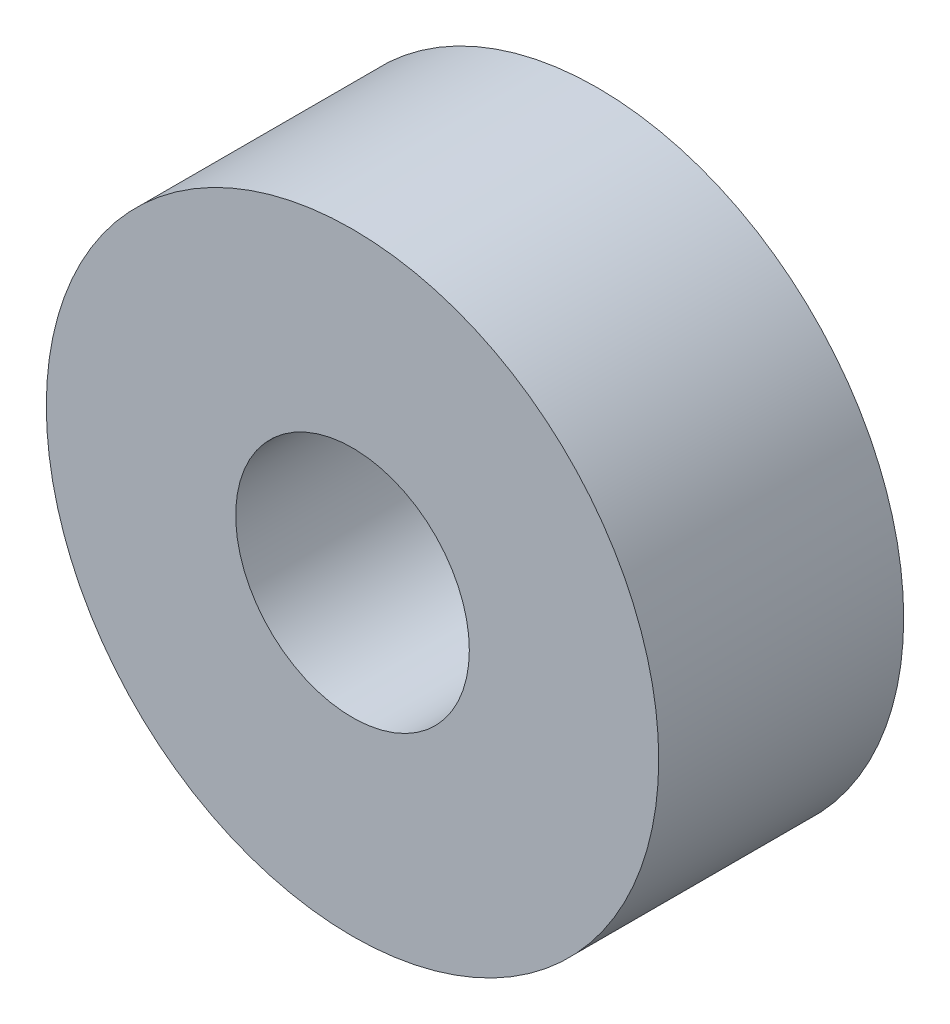
ISO-10303-21;
HEADER;
FILE_DESCRIPTION(('STEP AP214'),'2;1');
FILE_NAME('part.step','',(''),(''),'','','');
FILE_SCHEMA(('AUTOMOTIVE_DESIGN { 1 0 10303 214 1 1 1 1 }'));
ENDSEC;
DATA;
#1=APPLICATION_CONTEXT('core data for automotive mechanical design processes');
#2=APPLICATION_PROTOCOL_DEFINITION('international standard','automotive_design',2000,#1);
#3=PRODUCT_CONTEXT('',#1,'mechanical');
#4=PRODUCT('Part','Part','',(#3));
#5=PRODUCT_RELATED_PRODUCT_CATEGORY('part','',(#4));
#6=PRODUCT_DEFINITION_FORMATION('','',#4);
#7=PRODUCT_DEFINITION_CONTEXT('part definition',#1,'design');
#8=PRODUCT_DEFINITION('design','',#6,#7);
#9=PRODUCT_DEFINITION_SHAPE('','',#8);
#10=(LENGTH_UNIT() NAMED_UNIT(*) SI_UNIT(.MILLI.,.METRE.));
#11=(NAMED_UNIT(*) PLANE_ANGLE_UNIT() SI_UNIT($,.RADIAN.));
#12=(NAMED_UNIT(*) SI_UNIT($,.STERADIAN.) SOLID_ANGLE_UNIT());
#13=UNCERTAINTY_MEASURE_WITH_UNIT(LENGTH_MEASURE(1.E-05),#10,'distance_accuracy_value','');
#14=(GEOMETRIC_REPRESENTATION_CONTEXT(3) GLOBAL_UNCERTAINTY_ASSIGNED_CONTEXT((#13)) GLOBAL_UNIT_ASSIGNED_CONTEXT((#10,
#11,#12)) REPRESENTATION_CONTEXT('',''));
#15=CARTESIAN_POINT('',(0.,0.,0.));
#16=DIRECTION('',(0.,0.,1.));
#17=DIRECTION('',(1.,0.,0.));
#18=AXIS2_PLACEMENT_3D('',#15,#16,#17);
#19=CARTESIAN_POINT('',(0.,0.,8.));
#20=DIRECTION('',(0.,0.,-1.));
#21=DIRECTION('',(-1.,0.,0.));
#22=AXIS2_PLACEMENT_3D('',#19,#20,#21);
#23=CYLINDRICAL_SURFACE('',#22,10.);
#24=CARTESIAN_POINT('',(0.,0.,8.));
#25=DIRECTION('',(0.,0.,1.));
#26=DIRECTION('',(1.,0.,0.));
#27=AXIS2_PLACEMENT_3D('',#24,#25,#26);
#28=CIRCLE('',#27,10.);
#29=CARTESIAN_POINT('',(10.,0.,8.));
#30=VERTEX_POINT('',#29);
#31=EDGE_CURVE('E10',#30,#30,#28,.T.);
#32=ORIENTED_EDGE('',*,*,#31,.F.);
#33=EDGE_LOOP('',(#32));
#34=FACE_BOUND('',#33,.T.);
#35=CARTESIAN_POINT('',(0.,0.,0.));
#36=DIRECTION('',(0.,0.,1.));
#37=DIRECTION('',(1.,0.,0.));
#38=AXIS2_PLACEMENT_3D('',#35,#36,#37);
#39=CIRCLE('',#38,10.);
#40=CARTESIAN_POINT('',(10.,0.,0.));
#41=VERTEX_POINT('',#40);
#42=EDGE_CURVE('E40',#41,#41,#39,.T.);
#43=ORIENTED_EDGE('',*,*,#42,.T.);
#44=EDGE_LOOP('',(#43));
#45=FACE_BOUND('',#44,.T.);
#46=ADVANCED_FACE('F37',(#34,#45),#23,.T.);
#47=CARTESIAN_POINT('',(0.,0.,8.));
#48=DIRECTION('',(0.,0.,1.));
#49=DIRECTION('',(1.,0.,0.));
#50=AXIS2_PLACEMENT_3D('',#47,#48,#49);
#51=PLANE('',#50);
#52=CARTESIAN_POINT('',(0.,0.,8.));
#53=DIRECTION('',(0.,0.,1.));
#54=DIRECTION('',(1.,0.,0.));
#55=AXIS2_PLACEMENT_3D('',#52,#53,#54);
#56=CIRCLE('',#55,3.815);
#57=CARTESIAN_POINT('',(3.815,0.,8.));
#58=VERTEX_POINT('',#57);
#59=EDGE_CURVE('E49',#58,#58,#56,.T.);
#60=ORIENTED_EDGE('',*,*,#59,.F.);
#61=EDGE_LOOP('',(#60));
#62=FACE_BOUND('',#61,.T.);
#63=ORIENTED_EDGE('',*,*,#31,.T.);
#64=EDGE_LOOP('',(#63));
#65=FACE_BOUND('',#64,.T.);
#66=ADVANCED_FACE('F64',(#62,#65),#51,.T.);
#67=CARTESIAN_POINT('',(0.,0.,0.));
#68=DIRECTION('',(0.,0.,1.));
#69=DIRECTION('',(1.,0.,0.));
#70=AXIS2_PLACEMENT_3D('',#67,#68,#69);
#71=PLANE('',#70);
#72=CARTESIAN_POINT('',(0.,0.,0.));
#73=DIRECTION('',(0.,0.,1.));
#74=DIRECTION('',(1.,0.,0.));
#75=AXIS2_PLACEMENT_3D('',#72,#73,#74);
#76=CIRCLE('',#75,3.815);
#77=CARTESIAN_POINT('',(3.815,0.,0.));
#78=VERTEX_POINT('',#77);
#79=EDGE_CURVE('E47',#78,#78,#76,.T.);
#80=ORIENTED_EDGE('',*,*,#79,.T.);
#81=EDGE_LOOP('',(#80));
#82=FACE_BOUND('',#81,.T.);
#83=ORIENTED_EDGE('',*,*,#42,.F.);
#84=EDGE_LOOP('',(#83));
#85=FACE_BOUND('',#84,.T.);
#86=ADVANCED_FACE('F55',(#82,#85),#71,.F.);
#87=CARTESIAN_POINT('',(0.,0.,0.));
#88=DIRECTION('',(0.,0.,1.));
#89=DIRECTION('',(1.,0.,0.));
#90=AXIS2_PLACEMENT_3D('',#87,#88,#89);
#91=CYLINDRICAL_SURFACE('',#90,3.815);
#92=ORIENTED_EDGE('',*,*,#79,.F.);
#93=EDGE_LOOP('',(#92));
#94=FACE_BOUND('',#93,.T.);
#95=ORIENTED_EDGE('',*,*,#59,.T.);
#96=EDGE_LOOP('',(#95));
#97=FACE_BOUND('',#96,.T.);
#98=ADVANCED_FACE('F58',(#94,#97),#91,.F.);
#99=CLOSED_SHELL('',(#46,#66,#86,#98));
#100=MANIFOLD_SOLID_BREP('B2',#99);
#101=ADVANCED_BREP_SHAPE_REPRESENTATION('',(#18,#100),#14);
#102=SHAPE_DEFINITION_REPRESENTATION(#9,#101);
ENDSEC;
END-ISO-10303-21;
